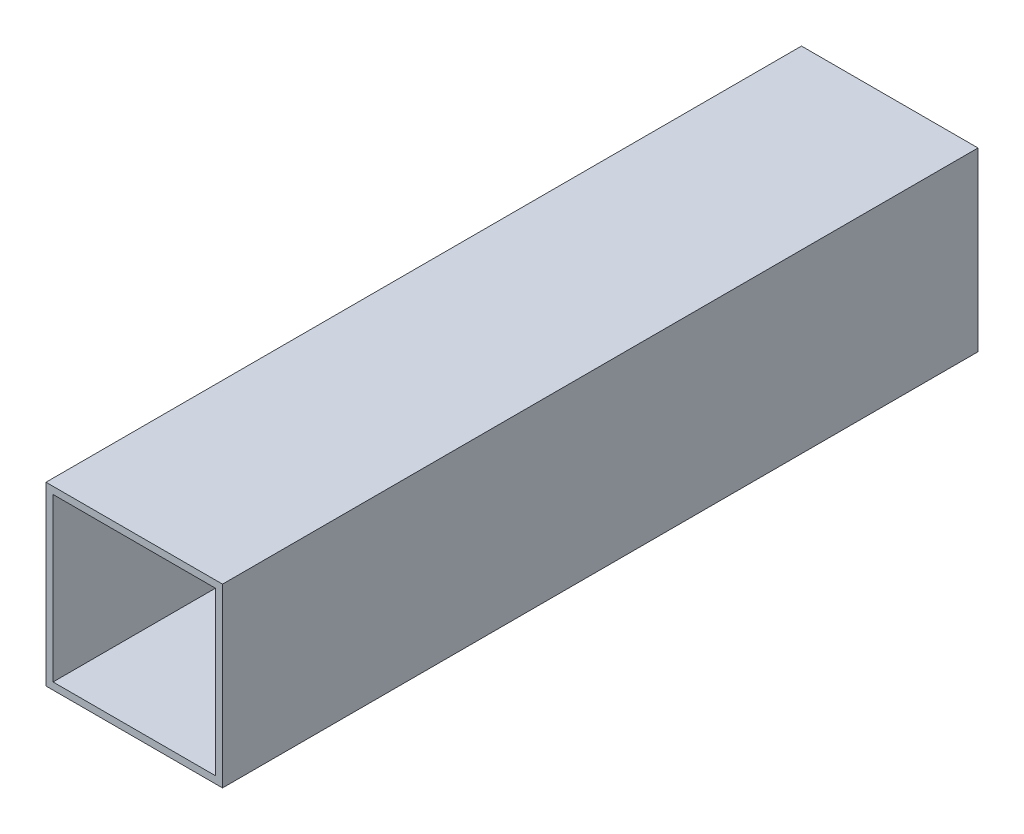
ISO-10303-21;
HEADER;
FILE_DESCRIPTION(('STEP AP214'),'2;1');
FILE_NAME('part.step','',(''),(''),'','','');
FILE_SCHEMA(('AUTOMOTIVE_DESIGN { 1 0 10303 214 1 1 1 1 }'));
ENDSEC;
DATA;
#1=APPLICATION_CONTEXT('core data for automotive mechanical design processes');
#2=APPLICATION_PROTOCOL_DEFINITION('international standard','automotive_design',2000,#1);
#3=PRODUCT_CONTEXT('',#1,'mechanical');
#4=PRODUCT('Part','Part','',(#3));
#5=PRODUCT_RELATED_PRODUCT_CATEGORY('part','',(#4));
#6=PRODUCT_DEFINITION_FORMATION('','',#4);
#7=PRODUCT_DEFINITION_CONTEXT('part definition',#1,'design');
#8=PRODUCT_DEFINITION('design','',#6,#7);
#9=PRODUCT_DEFINITION_SHAPE('','',#8);
#10=(LENGTH_UNIT() NAMED_UNIT(*) SI_UNIT(.MILLI.,.METRE.));
#11=(NAMED_UNIT(*) PLANE_ANGLE_UNIT() SI_UNIT($,.RADIAN.));
#12=(NAMED_UNIT(*) SI_UNIT($,.STERADIAN.) SOLID_ANGLE_UNIT());
#13=UNCERTAINTY_MEASURE_WITH_UNIT(LENGTH_MEASURE(1.E-05),#10,'distance_accuracy_value','');
#14=(GEOMETRIC_REPRESENTATION_CONTEXT(3) GLOBAL_UNCERTAINTY_ASSIGNED_CONTEXT((#13)) GLOBAL_UNIT_ASSIGNED_CONTEXT((#10,
#11,#12)) REPRESENTATION_CONTEXT('',''));
#15=CARTESIAN_POINT('',(0.,0.,0.));
#16=DIRECTION('',(0.,0.,1.));
#17=DIRECTION('',(1.,0.,0.));
#18=AXIS2_PLACEMENT_3D('',#15,#16,#17);
#19=CARTESIAN_POINT('',(0.,0.,214.));
#20=DIRECTION('',(0.,0.,-1.));
#21=DIRECTION('',(-1.,0.,0.));
#22=AXIS2_PLACEMENT_3D('',#19,#20,#21);
#23=PLANE('',#22);
#24=DIRECTION('',(0.,1.,0.));
#25=VECTOR('',#24,1.);
#26=CARTESIAN_POINT('',(25.,-25.,214.));
#27=LINE('',#26,#25);
#28=CARTESIAN_POINT('',(25.,-25.,214.));
#29=VERTEX_POINT('',#28);
#30=CARTESIAN_POINT('',(25.,25.,214.));
#31=VERTEX_POINT('',#30);
#32=EDGE_CURVE('E153',#29,#31,#27,.T.);
#33=ORIENTED_EDGE('',*,*,#32,.T.);
#34=DIRECTION('',(-1.,0.,0.));
#35=VECTOR('',#34,1.);
#36=CARTESIAN_POINT('',(-25.,25.,214.));
#37=LINE('',#36,#35);
#38=CARTESIAN_POINT('',(-25.,25.,214.));
#39=VERTEX_POINT('',#38);
#40=EDGE_CURVE('E157',#31,#39,#37,.T.);
#41=ORIENTED_EDGE('',*,*,#40,.T.);
#42=DIRECTION('',(0.,-1.,0.));
#43=VECTOR('',#42,1.);
#44=CARTESIAN_POINT('',(-25.,-25.,214.));
#45=LINE('',#44,#43);
#46=CARTESIAN_POINT('',(-25.,-25.,214.));
#47=VERTEX_POINT('',#46);
#48=EDGE_CURVE('E161',#39,#47,#45,.T.);
#49=ORIENTED_EDGE('',*,*,#48,.T.);
#50=DIRECTION('',(1.,0.,0.));
#51=VECTOR('',#50,1.);
#52=CARTESIAN_POINT('',(-25.,-25.,214.));
#53=LINE('',#52,#51);
#54=EDGE_CURVE('E164',#47,#29,#53,.T.);
#55=ORIENTED_EDGE('',*,*,#54,.T.);
#56=EDGE_LOOP('',(#33,#41,#49,#55));
#57=FACE_BOUND('',#56,.T.);
#58=DIRECTION('',(0.,1.,0.));
#59=VECTOR('',#58,1.);
#60=CARTESIAN_POINT('',(23.,-23.,214.));
#61=LINE('',#60,#59);
#62=CARTESIAN_POINT('',(23.,-23.,214.));
#63=VERTEX_POINT('',#62);
#64=CARTESIAN_POINT('',(23.,23.,214.));
#65=VERTEX_POINT('',#64);
#66=EDGE_CURVE('E105',#63,#65,#61,.T.);
#67=ORIENTED_EDGE('',*,*,#66,.F.);
#68=DIRECTION('',(1.,0.,0.));
#69=VECTOR('',#68,1.);
#70=CARTESIAN_POINT('',(-23.,-23.,214.));
#71=LINE('',#70,#69);
#72=CARTESIAN_POINT('',(-23.,-23.,214.));
#73=VERTEX_POINT('',#72);
#74=EDGE_CURVE('E131',#73,#63,#71,.T.);
#75=ORIENTED_EDGE('',*,*,#74,.F.);
#76=DIRECTION('',(0.,-1.,0.));
#77=VECTOR('',#76,1.);
#78=CARTESIAN_POINT('',(-23.,-23.,214.));
#79=LINE('',#78,#77);
#80=CARTESIAN_POINT('',(-23.,23.,214.));
#81=VERTEX_POINT('',#80);
#82=EDGE_CURVE('E127',#81,#73,#79,.T.);
#83=ORIENTED_EDGE('',*,*,#82,.F.);
#84=DIRECTION('',(-1.,0.,0.));
#85=VECTOR('',#84,1.);
#86=CARTESIAN_POINT('',(-23.,23.,214.));
#87=LINE('',#86,#85);
#88=EDGE_CURVE('E114',#65,#81,#87,.T.);
#89=ORIENTED_EDGE('',*,*,#88,.F.);
#90=EDGE_LOOP('',(#67,#75,#83,#89));
#91=FACE_BOUND('',#90,.T.);
#92=ADVANCED_FACE('F39',(#57,#91),#23,.F.);
#93=CARTESIAN_POINT('',(0.,0.,0.));
#94=DIRECTION('',(0.,0.,-1.));
#95=DIRECTION('',(-1.,0.,0.));
#96=AXIS2_PLACEMENT_3D('',#93,#94,#95);
#97=PLANE('',#96);
#98=DIRECTION('',(0.,1.,0.));
#99=VECTOR('',#98,1.);
#100=CARTESIAN_POINT('',(25.,-25.,0.));
#101=LINE('',#100,#99);
#102=CARTESIAN_POINT('',(25.,-25.,0.));
#103=VERTEX_POINT('',#102);
#104=CARTESIAN_POINT('',(25.,25.,0.));
#105=VERTEX_POINT('',#104);
#106=EDGE_CURVE('E123',#103,#105,#101,.T.);
#107=ORIENTED_EDGE('',*,*,#106,.F.);
#108=DIRECTION('',(1.,0.,0.));
#109=VECTOR('',#108,1.);
#110=CARTESIAN_POINT('',(-25.,-25.,0.));
#111=LINE('',#110,#109);
#112=CARTESIAN_POINT('',(-25.,-25.,0.));
#113=VERTEX_POINT('',#112);
#114=EDGE_CURVE('E158',#113,#103,#111,.T.);
#115=ORIENTED_EDGE('',*,*,#114,.F.);
#116=DIRECTION('',(0.,-1.,0.));
#117=VECTOR('',#116,1.);
#118=CARTESIAN_POINT('',(-25.,-25.,0.));
#119=LINE('',#118,#117);
#120=CARTESIAN_POINT('',(-25.,25.,0.));
#121=VERTEX_POINT('',#120);
#122=EDGE_CURVE('E174',#121,#113,#119,.T.);
#123=ORIENTED_EDGE('',*,*,#122,.F.);
#124=DIRECTION('',(-1.,0.,0.));
#125=VECTOR('',#124,1.);
#126=CARTESIAN_POINT('',(-25.,25.,0.));
#127=LINE('',#126,#125);
#128=EDGE_CURVE('E171',#105,#121,#127,.T.);
#129=ORIENTED_EDGE('',*,*,#128,.F.);
#130=EDGE_LOOP('',(#107,#115,#123,#129));
#131=FACE_BOUND('',#130,.T.);
#132=DIRECTION('',(1.,0.,0.));
#133=VECTOR('',#132,1.);
#134=CARTESIAN_POINT('',(-23.,-23.,0.));
#135=LINE('',#134,#133);
#136=CARTESIAN_POINT('',(-23.,-23.,0.));
#137=VERTEX_POINT('',#136);
#138=CARTESIAN_POINT('',(23.,-23.,0.));
#139=VERTEX_POINT('',#138);
#140=EDGE_CURVE('E115',#137,#139,#135,.T.);
#141=ORIENTED_EDGE('',*,*,#140,.T.);
#142=DIRECTION('',(0.,1.,0.));
#143=VECTOR('',#142,1.);
#144=CARTESIAN_POINT('',(23.,-23.,0.));
#145=LINE('',#144,#143);
#146=CARTESIAN_POINT('',(23.,23.,0.));
#147=VERTEX_POINT('',#146);
#148=EDGE_CURVE('E63',#139,#147,#145,.T.);
#149=ORIENTED_EDGE('',*,*,#148,.T.);
#150=DIRECTION('',(-1.,0.,0.));
#151=VECTOR('',#150,1.);
#152=CARTESIAN_POINT('',(-23.,23.,0.));
#153=LINE('',#152,#151);
#154=CARTESIAN_POINT('',(-23.,23.,0.));
#155=VERTEX_POINT('',#154);
#156=EDGE_CURVE('E121',#147,#155,#153,.T.);
#157=ORIENTED_EDGE('',*,*,#156,.T.);
#158=DIRECTION('',(0.,-1.,0.));
#159=VECTOR('',#158,1.);
#160=CARTESIAN_POINT('',(-23.,-23.,0.));
#161=LINE('',#160,#159);
#162=EDGE_CURVE('E140',#155,#137,#161,.T.);
#163=ORIENTED_EDGE('',*,*,#162,.T.);
#164=EDGE_LOOP('',(#141,#149,#157,#163));
#165=FACE_BOUND('',#164,.T.);
#166=ADVANCED_FACE('F197',(#131,#165),#97,.T.);
#167=CARTESIAN_POINT('',(25.,-25.,214.));
#168=DIRECTION('',(-1.,0.,0.));
#169=DIRECTION('',(0.,0.,1.));
#170=AXIS2_PLACEMENT_3D('',#167,#168,#169);
#171=PLANE('',#170);
#172=ORIENTED_EDGE('',*,*,#106,.T.);
#173=DIRECTION('',(0.,0.,-1.));
#174=VECTOR('',#173,1.);
#175=CARTESIAN_POINT('',(25.,25.,214.));
#176=LINE('',#175,#174);
#177=EDGE_CURVE('E11',#31,#105,#176,.T.);
#178=ORIENTED_EDGE('',*,*,#177,.F.);
#179=ORIENTED_EDGE('',*,*,#32,.F.);
#180=DIRECTION('',(0.,0.,-1.));
#181=VECTOR('',#180,1.);
#182=CARTESIAN_POINT('',(25.,-25.,214.));
#183=LINE('',#182,#181);
#184=EDGE_CURVE('E167',#29,#103,#183,.T.);
#185=ORIENTED_EDGE('',*,*,#184,.T.);
#186=EDGE_LOOP('',(#172,#178,#179,#185));
#187=FACE_BOUND('',#186,.T.);
#188=ADVANCED_FACE('F41',(#187),#171,.F.);
#189=CARTESIAN_POINT('',(-25.,25.,214.));
#190=DIRECTION('',(0.,-1.,0.));
#191=DIRECTION('',(0.,0.,-1.));
#192=AXIS2_PLACEMENT_3D('',#189,#190,#191);
#193=PLANE('',#192);
#194=ORIENTED_EDGE('',*,*,#128,.T.);
#195=DIRECTION('',(0.,0.,-1.));
#196=VECTOR('',#195,1.);
#197=CARTESIAN_POINT('',(-25.,25.,214.));
#198=LINE('',#197,#196);
#199=EDGE_CURVE('E48',#39,#121,#198,.T.);
#200=ORIENTED_EDGE('',*,*,#199,.F.);
#201=ORIENTED_EDGE('',*,*,#40,.F.);
#202=ORIENTED_EDGE('',*,*,#177,.T.);
#203=EDGE_LOOP('',(#194,#200,#201,#202));
#204=FACE_BOUND('',#203,.T.);
#205=ADVANCED_FACE('F207',(#204),#193,.F.);
#206=CARTESIAN_POINT('',(-25.,-25.,214.));
#207=DIRECTION('',(1.,0.,0.));
#208=DIRECTION('',(0.,0.,-1.));
#209=AXIS2_PLACEMENT_3D('',#206,#207,#208);
#210=PLANE('',#209);
#211=ORIENTED_EDGE('',*,*,#122,.T.);
#212=DIRECTION('',(0.,0.,-1.));
#213=VECTOR('',#212,1.);
#214=CARTESIAN_POINT('',(-25.,-25.,214.));
#215=LINE('',#214,#213);
#216=EDGE_CURVE('E182',#47,#113,#215,.T.);
#217=ORIENTED_EDGE('',*,*,#216,.F.);
#218=ORIENTED_EDGE('',*,*,#48,.F.);
#219=ORIENTED_EDGE('',*,*,#199,.T.);
#220=EDGE_LOOP('',(#211,#217,#218,#219));
#221=FACE_BOUND('',#220,.T.);
#222=ADVANCED_FACE('F191',(#221),#210,.F.);
#223=CARTESIAN_POINT('',(-25.,-25.,214.));
#224=DIRECTION('',(0.,1.,0.));
#225=DIRECTION('',(0.,0.,1.));
#226=AXIS2_PLACEMENT_3D('',#223,#224,#225);
#227=PLANE('',#226);
#228=ORIENTED_EDGE('',*,*,#114,.T.);
#229=ORIENTED_EDGE('',*,*,#184,.F.);
#230=ORIENTED_EDGE('',*,*,#54,.F.);
#231=ORIENTED_EDGE('',*,*,#216,.T.);
#232=EDGE_LOOP('',(#228,#229,#230,#231));
#233=FACE_BOUND('',#232,.T.);
#234=ADVANCED_FACE('F201',(#233),#227,.F.);
#235=CARTESIAN_POINT('',(23.,-23.,214.));
#236=DIRECTION('',(-1.,0.,0.));
#237=DIRECTION('',(0.,0.,1.));
#238=AXIS2_PLACEMENT_3D('',#235,#236,#237);
#239=PLANE('',#238);
#240=ORIENTED_EDGE('',*,*,#148,.F.);
#241=DIRECTION('',(0.,0.,-1.));
#242=VECTOR('',#241,1.);
#243=CARTESIAN_POINT('',(23.,-23.,214.));
#244=LINE('',#243,#242);
#245=EDGE_CURVE('E109',#63,#139,#244,.T.);
#246=ORIENTED_EDGE('',*,*,#245,.F.);
#247=ORIENTED_EDGE('',*,*,#66,.T.);
#248=DIRECTION('',(0.,0.,-1.));
#249=VECTOR('',#248,1.);
#250=CARTESIAN_POINT('',(23.,23.,214.));
#251=LINE('',#250,#249);
#252=EDGE_CURVE('E108',#65,#147,#251,.T.);
#253=ORIENTED_EDGE('',*,*,#252,.T.);
#254=EDGE_LOOP('',(#240,#246,#247,#253));
#255=FACE_BOUND('',#254,.T.);
#256=ADVANCED_FACE('F107',(#255),#239,.T.);
#257=CARTESIAN_POINT('',(-23.,23.,214.));
#258=DIRECTION('',(0.,-1.,0.));
#259=DIRECTION('',(0.,0.,-1.));
#260=AXIS2_PLACEMENT_3D('',#257,#258,#259);
#261=PLANE('',#260);
#262=ORIENTED_EDGE('',*,*,#156,.F.);
#263=ORIENTED_EDGE('',*,*,#252,.F.);
#264=ORIENTED_EDGE('',*,*,#88,.T.);
#265=DIRECTION('',(0.,0.,-1.));
#266=VECTOR('',#265,1.);
#267=CARTESIAN_POINT('',(-23.,23.,214.));
#268=LINE('',#267,#266);
#269=EDGE_CURVE('E124',#81,#155,#268,.T.);
#270=ORIENTED_EDGE('',*,*,#269,.T.);
#271=EDGE_LOOP('',(#262,#263,#264,#270));
#272=FACE_BOUND('',#271,.T.);
#273=ADVANCED_FACE('F118',(#272),#261,.T.);
#274=CARTESIAN_POINT('',(-23.,-23.,214.));
#275=DIRECTION('',(1.,0.,0.));
#276=DIRECTION('',(0.,0.,-1.));
#277=AXIS2_PLACEMENT_3D('',#274,#275,#276);
#278=PLANE('',#277);
#279=ORIENTED_EDGE('',*,*,#162,.F.);
#280=ORIENTED_EDGE('',*,*,#269,.F.);
#281=ORIENTED_EDGE('',*,*,#82,.T.);
#282=DIRECTION('',(0.,0.,-1.));
#283=VECTOR('',#282,1.);
#284=CARTESIAN_POINT('',(-23.,-23.,214.));
#285=LINE('',#284,#283);
#286=EDGE_CURVE('E55',#73,#137,#285,.T.);
#287=ORIENTED_EDGE('',*,*,#286,.T.);
#288=EDGE_LOOP('',(#279,#280,#281,#287));
#289=FACE_BOUND('',#288,.T.);
#290=ADVANCED_FACE('F230',(#289),#278,.T.);
#291=CARTESIAN_POINT('',(-23.,-23.,214.));
#292=DIRECTION('',(0.,1.,0.));
#293=DIRECTION('',(0.,0.,1.));
#294=AXIS2_PLACEMENT_3D('',#291,#292,#293);
#295=PLANE('',#294);
#296=ORIENTED_EDGE('',*,*,#140,.F.);
#297=ORIENTED_EDGE('',*,*,#286,.F.);
#298=ORIENTED_EDGE('',*,*,#74,.T.);
#299=ORIENTED_EDGE('',*,*,#245,.T.);
#300=EDGE_LOOP('',(#296,#297,#298,#299));
#301=FACE_BOUND('',#300,.T.);
#302=ADVANCED_FACE('F234',(#301),#295,.T.);
#303=CLOSED_SHELL('',(#92,#166,#188,#205,#222,#234,#256,#273,#290,#302));
#304=MANIFOLD_SOLID_BREP('B2',#303);
#305=ADVANCED_BREP_SHAPE_REPRESENTATION('',(#18,#304),#14);
#306=SHAPE_DEFINITION_REPRESENTATION(#9,#305);
ENDSEC;
END-ISO-10303-21;
